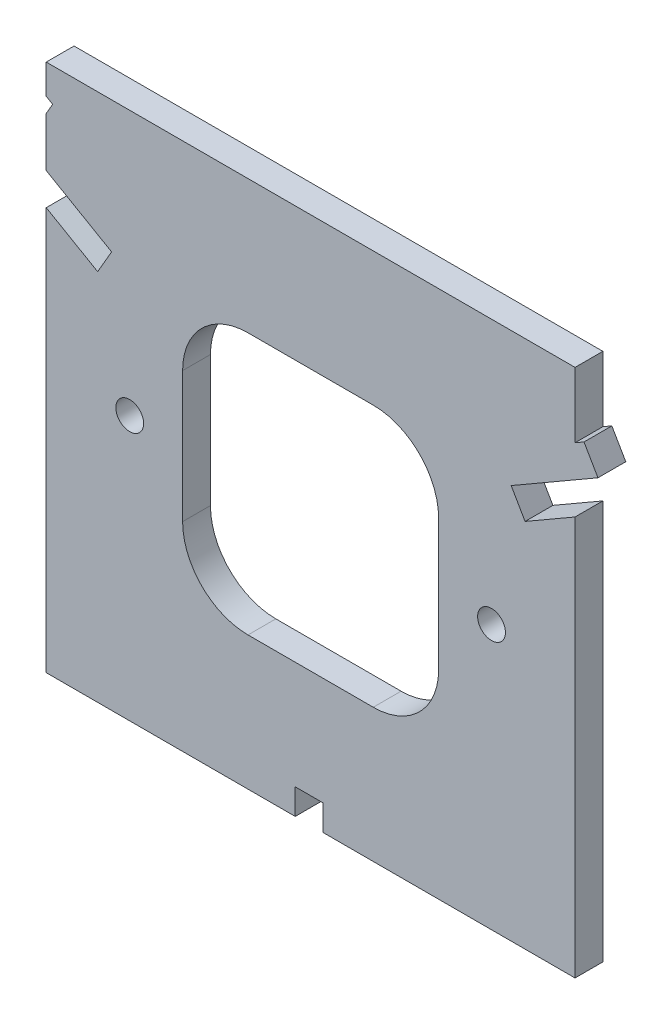
ISO-10303-21;
HEADER;
FILE_DESCRIPTION(('STEP AP214'),'2;1');
FILE_NAME('part.step','',(''),(''),'','','');
FILE_SCHEMA(('AUTOMOTIVE_DESIGN { 1 0 10303 214 1 1 1 1 }'));
ENDSEC;
DATA;
#1=APPLICATION_CONTEXT('core data for automotive mechanical design processes');
#2=APPLICATION_PROTOCOL_DEFINITION('international standard','automotive_design',2000,#1);
#3=PRODUCT_CONTEXT('',#1,'mechanical');
#4=PRODUCT('Part','Part','',(#3));
#5=PRODUCT_RELATED_PRODUCT_CATEGORY('part','',(#4));
#6=PRODUCT_DEFINITION_FORMATION('','',#4);
#7=PRODUCT_DEFINITION_CONTEXT('part definition',#1,'design');
#8=PRODUCT_DEFINITION('design','',#6,#7);
#9=PRODUCT_DEFINITION_SHAPE('','',#8);
#10=(LENGTH_UNIT() NAMED_UNIT(*) SI_UNIT(.MILLI.,.METRE.));
#11=(NAMED_UNIT(*) PLANE_ANGLE_UNIT() SI_UNIT($,.RADIAN.));
#12=(NAMED_UNIT(*) SI_UNIT($,.STERADIAN.) SOLID_ANGLE_UNIT());
#13=UNCERTAINTY_MEASURE_WITH_UNIT(LENGTH_MEASURE(1.E-05),#10,'distance_accuracy_value','');
#14=(GEOMETRIC_REPRESENTATION_CONTEXT(3) GLOBAL_UNCERTAINTY_ASSIGNED_CONTEXT((#13)) GLOBAL_UNIT_ASSIGNED_CONTEXT((#10,
#11,#12)) REPRESENTATION_CONTEXT('',''));
#15=CARTESIAN_POINT('',(0.,0.,0.));
#16=DIRECTION('',(0.,0.,1.));
#17=DIRECTION('',(1.,0.,0.));
#18=AXIS2_PLACEMENT_3D('',#15,#16,#17);
#19=CARTESIAN_POINT('',(0.,0.,5.));
#20=DIRECTION('',(0.,0.,-1.));
#21=DIRECTION('',(-1.,0.,0.));
#22=AXIS2_PLACEMENT_3D('',#19,#20,#21);
#23=PLANE('',#22);
#24=CARTESIAN_POINT('',(8.4009612500342,-1.93892346319448,5.));
#25=DIRECTION('',(0.,0.,1.));
#26=DIRECTION('',(1.,0.,0.));
#27=AXIS2_PLACEMENT_3D('',#24,#25,#26);
#28=CIRCLE('',#27,2.50000000000002);
#29=CARTESIAN_POINT('',(10.9009612500342,-1.93892346319448,5.));
#30=VERTEX_POINT('',#29);
#31=EDGE_CURVE('E262',#30,#30,#28,.T.);
#32=ORIENTED_EDGE('',*,*,#31,.F.);
#33=EDGE_LOOP('',(#32));
#34=FACE_BOUND('',#33,.T.);
#35=DIRECTION('',(0.,1.,0.));
#36=VECTOR('',#35,1.);
#37=CARTESIAN_POINT('',(23.4009612500341,33.8352715378525,5.));
#38=LINE('',#37,#36);
#39=CARTESIAN_POINT('',(23.4009612500341,33.8352715378525,5.));
#40=VERTEX_POINT('',#39);
#41=CARTESIAN_POINT('',(23.4009612500341,45.5610765368055,5.));
#42=VERTEX_POINT('',#41);
#43=EDGE_CURVE('E293',#40,#42,#38,.T.);
#44=ORIENTED_EDGE('',*,*,#43,.T.);
#45=DIRECTION('',(-1.,0.,0.));
#46=VECTOR('',#45,1.);
#47=CARTESIAN_POINT('',(-71.5990387499659,45.5610765368055,5.));
#48=LINE('',#47,#46);
#49=CARTESIAN_POINT('',(-71.5990387499659,45.5610765368055,5.));
#50=VERTEX_POINT('',#49);
#51=EDGE_CURVE('E296',#42,#50,#48,.T.);
#52=ORIENTED_EDGE('',*,*,#51,.T.);
#53=DIRECTION('',(0.,-1.,0.));
#54=VECTOR('',#53,1.);
#55=CARTESIAN_POINT('',(-71.5990387499659,40.2291678763583,5.));
#56=LINE('',#55,#54);
#57=CARTESIAN_POINT('',(-71.5990387499659,40.2291678763583,5.));
#58=VERTEX_POINT('',#57);
#59=EDGE_CURVE('E299',#50,#58,#56,.T.);
#60=ORIENTED_EDGE('',*,*,#59,.T.);
#61=DIRECTION('',(0.866025403784445,-0.499999999999989,0.));
#62=VECTOR('',#61,1.);
#63=CARTESIAN_POINT('',(-70.4449389685419,39.5628480568815,5.));
#64=LINE('',#63,#62);
#65=CARTESIAN_POINT('',(-70.4449389685419,39.5628480568815,5.));
#66=VERTEX_POINT('',#65);
#67=EDGE_CURVE('E301',#58,#66,#64,.T.);
#68=ORIENTED_EDGE('',*,*,#67,.T.);
#69=DIRECTION('',(-0.500000000000001,-0.866025403784438,0.));
#70=VECTOR('',#69,1.);
#71=CARTESIAN_POINT('',(-71.5990387499659,37.5638885984511,5.));
#72=LINE('',#71,#70);
#73=CARTESIAN_POINT('',(-71.5990387499659,37.5638885984511,5.));
#74=VERTEX_POINT('',#73);
#75=EDGE_CURVE('E303',#66,#74,#72,.T.);
#76=ORIENTED_EDGE('',*,*,#75,.T.);
#77=DIRECTION('',(0.,-1.,0.));
#78=VECTOR('',#77,1.);
#79=CARTESIAN_POINT('',(-71.5990387499659,28.682162492566,5.));
#80=LINE('',#79,#78);
#81=CARTESIAN_POINT('',(-71.5990387499659,28.682162492566,5.));
#82=VERTEX_POINT('',#81);
#83=EDGE_CURVE('E305',#74,#82,#80,.T.);
#84=ORIENTED_EDGE('',*,*,#83,.T.);
#85=DIRECTION('',(0.866025403784435,-0.500000000000006,0.));
#86=VECTOR('',#85,1.);
#87=CARTESIAN_POINT('',(-71.5990387499659,28.682162492566,5.));
#88=LINE('',#87,#86);
#89=CARTESIAN_POINT('',(-59.8564817004216,21.902594019037,5.));
#90=VERTEX_POINT('',#89);
#91=EDGE_CURVE('E307',#82,#90,#88,.T.);
#92=ORIENTED_EDGE('',*,*,#91,.T.);
#93=DIRECTION('',(-0.500000000000005,-0.866025403784436,0.));
#94=VECTOR('',#93,1.);
#95=CARTESIAN_POINT('',(-59.8564817004216,21.902594019037,5.));
#96=LINE('',#95,#94);
#97=CARTESIAN_POINT('',(-62.3564817004217,17.5724670001147,5.));
#98=VERTEX_POINT('',#97);
#99=EDGE_CURVE('E309',#90,#98,#96,.T.);
#100=ORIENTED_EDGE('',*,*,#99,.T.);
#101=DIRECTION('',(-0.866025403784435,0.500000000000006,0.));
#102=VECTOR('',#101,1.);
#103=CARTESIAN_POINT('',(-62.3564817004217,17.5724670001147,5.));
#104=LINE('',#103,#102);
#105=CARTESIAN_POINT('',(-71.5990387499659,22.9086598006696,5.));
#106=VERTEX_POINT('',#105);
#107=EDGE_CURVE('E311',#98,#106,#104,.T.);
#108=ORIENTED_EDGE('',*,*,#107,.T.);
#109=DIRECTION('',(0.,-1.,0.));
#110=VECTOR('',#109,1.);
#111=CARTESIAN_POINT('',(-71.5990387499659,-49.4389234631945,5.));
#112=LINE('',#111,#110);
#113=CARTESIAN_POINT('',(-71.5990387499659,-49.4389234631945,5.));
#114=VERTEX_POINT('',#113);
#115=EDGE_CURVE('E313',#106,#114,#112,.T.);
#116=ORIENTED_EDGE('',*,*,#115,.T.);
#117=DIRECTION('',(1.,0.,0.));
#118=VECTOR('',#117,1.);
#119=CARTESIAN_POINT('',(-71.5990387499659,-49.4389234631945,5.));
#120=LINE('',#119,#118);
#121=CARTESIAN_POINT('',(-26.8676770791211,-49.4389234631945,5.));
#122=VERTEX_POINT('',#121);
#123=EDGE_CURVE('E315',#114,#122,#120,.T.);
#124=ORIENTED_EDGE('',*,*,#123,.T.);
#125=DIRECTION('',(0.,1.,0.));
#126=VECTOR('',#125,1.);
#127=CARTESIAN_POINT('',(-26.8676770791212,-44.8265361737777,5.));
#128=LINE('',#127,#126);
#129=CARTESIAN_POINT('',(-26.8676770791212,-44.8265361737777,5.));
#130=VERTEX_POINT('',#129);
#131=EDGE_CURVE('E317',#122,#130,#128,.T.);
#132=ORIENTED_EDGE('',*,*,#131,.T.);
#133=DIRECTION('',(1.,0.,0.));
#134=VECTOR('',#133,1.);
#135=CARTESIAN_POINT('',(-21.8676770791211,-44.8265361737777,5.));
#136=LINE('',#135,#134);
#137=CARTESIAN_POINT('',(-21.8676770791211,-44.8265361737777,5.));
#138=VERTEX_POINT('',#137);
#139=EDGE_CURVE('E319',#130,#138,#136,.T.);
#140=ORIENTED_EDGE('',*,*,#139,.T.);
#141=DIRECTION('',(0.,-1.,0.));
#142=VECTOR('',#141,1.);
#143=CARTESIAN_POINT('',(-21.8676770791211,-49.4389234631945,5.));
#144=LINE('',#143,#142);
#145=CARTESIAN_POINT('',(-21.8676770791211,-49.4389234631945,5.));
#146=VERTEX_POINT('',#145);
#147=EDGE_CURVE('E321',#138,#146,#144,.T.);
#148=ORIENTED_EDGE('',*,*,#147,.T.);
#149=DIRECTION('',(1.,0.,0.));
#150=VECTOR('',#149,1.);
#151=CARTESIAN_POINT('',(-21.8676770791211,-49.4389234631945,5.));
#152=LINE('',#151,#150);
#153=CARTESIAN_POINT('',(23.4009612500341,-49.4389234631945,5.));
#154=VERTEX_POINT('',#153);
#155=EDGE_CURVE('E323',#146,#154,#152,.T.);
#156=ORIENTED_EDGE('',*,*,#155,.T.);
#157=DIRECTION('',(0.,1.,0.));
#158=VECTOR('',#157,1.);
#159=CARTESIAN_POINT('',(23.4009612500341,-49.4389234631945,5.));
#160=LINE('',#159,#158);
#161=CARTESIAN_POINT('',(23.4009612500341,22.2882661540598,5.));
#162=VERTEX_POINT('',#161);
#163=EDGE_CURVE('E325',#154,#162,#160,.T.);
#164=ORIENTED_EDGE('',*,*,#163,.T.);
#165=DIRECTION('',(-0.866025403784432,-0.500000000000011,0.));
#166=VECTOR('',#165,1.);
#167=CARTESIAN_POINT('',(23.4009612500341,22.2882661540598,5.));
#168=LINE('',#167,#166);
#169=CARTESIAN_POINT('',(14.4270425296453,17.1071717651573,5.));
#170=VERTEX_POINT('',#169);
#171=EDGE_CURVE('E327',#162,#170,#168,.T.);
#172=ORIENTED_EDGE('',*,*,#171,.T.);
#173=DIRECTION('',(-0.500000000000011,0.866025403784432,0.));
#174=VECTOR('',#173,1.);
#175=CARTESIAN_POINT('',(14.4270425296453,17.1071717651573,5.));
#176=LINE('',#175,#174);
#177=CARTESIAN_POINT('',(11.9270425296452,21.4372987840795,5.));
#178=VERTEX_POINT('',#177);
#179=EDGE_CURVE('E329',#170,#178,#176,.T.);
#180=ORIENTED_EDGE('',*,*,#179,.T.);
#181=DIRECTION('',(0.866025403784441,0.499999999999996,0.));
#182=VECTOR('',#181,1.);
#183=CARTESIAN_POINT('',(11.9270425296452,21.4372987840795,5.));
#184=LINE('',#183,#182);
#185=CARTESIAN_POINT('',(27.5154997977651,30.4372987840794,5.));
#186=VERTEX_POINT('',#185);
#187=EDGE_CURVE('E331',#178,#186,#184,.T.);
#188=ORIENTED_EDGE('',*,*,#187,.T.);
#189=DIRECTION('',(-0.499999999999993,0.866025403784443,0.));
#190=VECTOR('',#189,1.);
#191=CARTESIAN_POINT('',(27.5154997977651,30.4372987840794,5.));
#192=LINE('',#191,#190);
#193=CARTESIAN_POINT('',(25.0154997977649,34.7674258030019,5.));
#194=VERTEX_POINT('',#193);
#195=EDGE_CURVE('E333',#186,#194,#192,.T.);
#196=ORIENTED_EDGE('',*,*,#195,.T.);
#197=DIRECTION('',(-0.866025403784439,-0.5,0.));
#198=VECTOR('',#197,1.);
#199=CARTESIAN_POINT('',(25.0154997977649,34.7674258030019,5.));
#200=LINE('',#199,#198);
#201=EDGE_CURVE('E335',#194,#40,#200,.T.);
#202=ORIENTED_EDGE('',*,*,#201,.T.);
#203=EDGE_LOOP('',(#44,#52,#60,#68,#76,#84,#92,#100,#108,#116,#124,#132,#140,#148,#156,#164,
#172,#180,#188,#196,#202));
#204=FACE_BOUND('',#203,.T.);
#205=CARTESIAN_POINT('',(-12.8490387499658,9.81107653680552,5.));
#206=DIRECTION('',(0.,0.,1.));
#207=DIRECTION('',(1.,0.,0.));
#208=AXIS2_PLACEMENT_3D('',#205,#206,#207);
#209=CIRCLE('',#208,11.75);
#210=CARTESIAN_POINT('',(-1.09903874996581,9.81107653680552,5.));
#211=VERTEX_POINT('',#210);
#212=CARTESIAN_POINT('',(-12.8490387499658,21.5610765368055,5.));
#213=VERTEX_POINT('',#212);
#214=EDGE_CURVE('E224',#211,#213,#209,.T.);
#215=ORIENTED_EDGE('',*,*,#214,.F.);
#216=DIRECTION('',(0.,1.,0.));
#217=VECTOR('',#216,1.);
#218=CARTESIAN_POINT('',(-1.09903874996581,-13.6889234631945,5.));
#219=LINE('',#218,#217);
#220=CARTESIAN_POINT('',(-1.09903874996628,-13.6889234631945,5.));
#221=VERTEX_POINT('',#220);
#222=EDGE_CURVE('E259',#221,#211,#219,.T.);
#223=ORIENTED_EDGE('',*,*,#222,.F.);
#224=CARTESIAN_POINT('',(-12.8490387499658,-13.6889234631945,5.));
#225=DIRECTION('',(0.,0.,1.));
#226=DIRECTION('',(1.,0.,0.));
#227=AXIS2_PLACEMENT_3D('',#224,#225,#226);
#228=CIRCLE('',#227,11.75);
#229=CARTESIAN_POINT('',(-12.8490387499658,-25.4389234631945,5.));
#230=VERTEX_POINT('',#229);
#231=EDGE_CURVE('E257',#230,#221,#228,.T.);
#232=ORIENTED_EDGE('',*,*,#231,.F.);
#233=DIRECTION('',(1.,0.,0.));
#234=VECTOR('',#233,1.);
#235=CARTESIAN_POINT('',(-12.8490387499658,-25.4389234631945,5.));
#236=LINE('',#235,#234);
#237=CARTESIAN_POINT('',(-35.3490387499658,-25.4389234631945,5.));
#238=VERTEX_POINT('',#237);
#239=EDGE_CURVE('E255',#238,#230,#236,.T.);
#240=ORIENTED_EDGE('',*,*,#239,.F.);
#241=CARTESIAN_POINT('',(-35.3490387499658,-13.6889234631945,5.));
#242=DIRECTION('',(0.,0.,1.));
#243=DIRECTION('',(1.,0.,0.));
#244=AXIS2_PLACEMENT_3D('',#241,#242,#243);
#245=CIRCLE('',#244,11.75);
#246=CARTESIAN_POINT('',(-47.0990387499658,-13.6889234631945,5.));
#247=VERTEX_POINT('',#246);
#248=EDGE_CURVE('E253',#247,#238,#245,.T.);
#249=ORIENTED_EDGE('',*,*,#248,.F.);
#250=DIRECTION('',(0.,-1.,0.));
#251=VECTOR('',#250,1.);
#252=CARTESIAN_POINT('',(-47.0990387499658,9.81107653680551,5.));
#253=LINE('',#252,#251);
#254=CARTESIAN_POINT('',(-47.0990387499658,9.81107653680551,5.));
#255=VERTEX_POINT('',#254);
#256=EDGE_CURVE('E248',#255,#247,#253,.T.);
#257=ORIENTED_EDGE('',*,*,#256,.F.);
#258=CARTESIAN_POINT('',(-35.3490387499658,9.81107653680551,5.));
#259=DIRECTION('',(0.,0.,1.));
#260=DIRECTION('',(1.,0.,0.));
#261=AXIS2_PLACEMENT_3D('',#258,#259,#260);
#262=CIRCLE('',#261,11.75);
#263=CARTESIAN_POINT('',(-35.3490387499658,21.5610765368055,5.));
#264=VERTEX_POINT('',#263);
#265=EDGE_CURVE('E246',#264,#255,#262,.T.);
#266=ORIENTED_EDGE('',*,*,#265,.F.);
#267=DIRECTION('',(-1.,0.,0.));
#268=VECTOR('',#267,1.);
#269=CARTESIAN_POINT('',(-12.8490387499658,21.5610765368055,5.));
#270=LINE('',#269,#268);
#271=EDGE_CURVE('E232',#213,#264,#270,.T.);
#272=ORIENTED_EDGE('',*,*,#271,.F.);
#273=EDGE_LOOP('',(#215,#223,#232,#240,#249,#257,#266,#272));
#274=FACE_BOUND('',#273,.T.);
#275=CARTESIAN_POINT('',(-56.5990387499658,-1.93892346319448,5.));
#276=DIRECTION('',(0.,0.,1.));
#277=DIRECTION('',(1.,0.,0.));
#278=AXIS2_PLACEMENT_3D('',#275,#276,#277);
#279=CIRCLE('',#278,2.50000000000002);
#280=CARTESIAN_POINT('',(-54.0990387499658,-1.93892346319448,5.));
#281=VERTEX_POINT('',#280);
#282=EDGE_CURVE('E836',#281,#281,#279,.T.);
#283=ORIENTED_EDGE('',*,*,#282,.F.);
#284=EDGE_LOOP('',(#283));
#285=FACE_BOUND('',#284,.T.);
#286=ADVANCED_FACE('F33',(#34,#204,#274,#285),#23,.F.);
#287=CARTESIAN_POINT('',(0.,0.,0.));
#288=DIRECTION('',(0.,0.,-1.));
#289=DIRECTION('',(-1.,0.,0.));
#290=AXIS2_PLACEMENT_3D('',#287,#288,#289);
#291=PLANE('',#290);
#292=CARTESIAN_POINT('',(8.4009612500342,-1.93892346319448,0.));
#293=DIRECTION('',(0.,0.,1.));
#294=DIRECTION('',(1.,0.,0.));
#295=AXIS2_PLACEMENT_3D('',#292,#293,#294);
#296=CIRCLE('',#295,2.50000000000002);
#297=CARTESIAN_POINT('',(10.9009612500342,-1.93892346319448,0.));
#298=VERTEX_POINT('',#297);
#299=EDGE_CURVE('E842',#298,#298,#296,.T.);
#300=ORIENTED_EDGE('',*,*,#299,.T.);
#301=EDGE_LOOP('',(#300));
#302=FACE_BOUND('',#301,.T.);
#303=DIRECTION('',(0.,1.,0.));
#304=VECTOR('',#303,1.);
#305=CARTESIAN_POINT('',(23.4009612500341,33.8352715378525,0.));
#306=LINE('',#305,#304);
#307=CARTESIAN_POINT('',(23.4009612500341,33.8352715378525,0.));
#308=VERTEX_POINT('',#307);
#309=CARTESIAN_POINT('',(23.4009612500341,45.5610765368055,0.));
#310=VERTEX_POINT('',#309);
#311=EDGE_CURVE('E240',#308,#310,#306,.T.);
#312=ORIENTED_EDGE('',*,*,#311,.F.);
#313=DIRECTION('',(-0.866025403784439,-0.5,0.));
#314=VECTOR('',#313,1.);
#315=CARTESIAN_POINT('',(25.0154997977649,34.7674258030019,0.));
#316=LINE('',#315,#314);
#317=CARTESIAN_POINT('',(25.0154997977649,34.7674258030019,0.));
#318=VERTEX_POINT('',#317);
#319=EDGE_CURVE('E297',#318,#308,#316,.T.);
#320=ORIENTED_EDGE('',*,*,#319,.F.);
#321=DIRECTION('',(-0.499999999999993,0.866025403784443,0.));
#322=VECTOR('',#321,1.);
#323=CARTESIAN_POINT('',(27.5154997977651,30.4372987840794,0.));
#324=LINE('',#323,#322);
#325=CARTESIAN_POINT('',(27.5154997977651,30.4372987840794,0.));
#326=VERTEX_POINT('',#325);
#327=EDGE_CURVE('E376',#326,#318,#324,.T.);
#328=ORIENTED_EDGE('',*,*,#327,.F.);
#329=DIRECTION('',(0.866025403784441,0.499999999999996,0.));
#330=VECTOR('',#329,1.);
#331=CARTESIAN_POINT('',(11.9270425296452,21.4372987840795,0.));
#332=LINE('',#331,#330);
#333=CARTESIAN_POINT('',(11.9270425296452,21.4372987840795,0.));
#334=VERTEX_POINT('',#333);
#335=EDGE_CURVE('E374',#334,#326,#332,.T.);
#336=ORIENTED_EDGE('',*,*,#335,.F.);
#337=DIRECTION('',(-0.500000000000011,0.866025403784432,0.));
#338=VECTOR('',#337,1.);
#339=CARTESIAN_POINT('',(14.4270425296453,17.1071717651573,0.));
#340=LINE('',#339,#338);
#341=CARTESIAN_POINT('',(14.4270425296453,17.1071717651573,0.));
#342=VERTEX_POINT('',#341);
#343=EDGE_CURVE('E372',#342,#334,#340,.T.);
#344=ORIENTED_EDGE('',*,*,#343,.F.);
#345=DIRECTION('',(-0.866025403784432,-0.500000000000011,0.));
#346=VECTOR('',#345,1.);
#347=CARTESIAN_POINT('',(23.4009612500341,22.2882661540598,0.));
#348=LINE('',#347,#346);
#349=CARTESIAN_POINT('',(23.4009612500341,22.2882661540598,0.));
#350=VERTEX_POINT('',#349);
#351=EDGE_CURVE('E370',#350,#342,#348,.T.);
#352=ORIENTED_EDGE('',*,*,#351,.F.);
#353=DIRECTION('',(0.,1.,0.));
#354=VECTOR('',#353,1.);
#355=CARTESIAN_POINT('',(23.4009612500341,-49.4389234631945,0.));
#356=LINE('',#355,#354);
#357=CARTESIAN_POINT('',(23.4009612500341,-49.4389234631945,0.));
#358=VERTEX_POINT('',#357);
#359=EDGE_CURVE('E368',#358,#350,#356,.T.);
#360=ORIENTED_EDGE('',*,*,#359,.F.);
#361=DIRECTION('',(1.,0.,0.));
#362=VECTOR('',#361,1.);
#363=CARTESIAN_POINT('',(-21.8676770791211,-49.4389234631945,0.));
#364=LINE('',#363,#362);
#365=CARTESIAN_POINT('',(-21.8676770791211,-49.4389234631945,0.));
#366=VERTEX_POINT('',#365);
#367=EDGE_CURVE('E366',#366,#358,#364,.T.);
#368=ORIENTED_EDGE('',*,*,#367,.F.);
#369=DIRECTION('',(0.,-1.,0.));
#370=VECTOR('',#369,1.);
#371=CARTESIAN_POINT('',(-21.8676770791211,-49.4389234631945,0.));
#372=LINE('',#371,#370);
#373=CARTESIAN_POINT('',(-21.8676770791211,-44.8265361737777,0.));
#374=VERTEX_POINT('',#373);
#375=EDGE_CURVE('E364',#374,#366,#372,.T.);
#376=ORIENTED_EDGE('',*,*,#375,.F.);
#377=DIRECTION('',(1.,0.,0.));
#378=VECTOR('',#377,1.);
#379=CARTESIAN_POINT('',(-21.8676770791211,-44.8265361737777,0.));
#380=LINE('',#379,#378);
#381=CARTESIAN_POINT('',(-26.8676770791212,-44.8265361737777,0.));
#382=VERTEX_POINT('',#381);
#383=EDGE_CURVE('E362',#382,#374,#380,.T.);
#384=ORIENTED_EDGE('',*,*,#383,.F.);
#385=DIRECTION('',(0.,1.,0.));
#386=VECTOR('',#385,1.);
#387=CARTESIAN_POINT('',(-26.8676770791212,-44.8265361737777,0.));
#388=LINE('',#387,#386);
#389=CARTESIAN_POINT('',(-26.8676770791211,-49.4389234631945,0.));
#390=VERTEX_POINT('',#389);
#391=EDGE_CURVE('E360',#390,#382,#388,.T.);
#392=ORIENTED_EDGE('',*,*,#391,.F.);
#393=DIRECTION('',(1.,0.,0.));
#394=VECTOR('',#393,1.);
#395=CARTESIAN_POINT('',(-71.5990387499659,-49.4389234631945,0.));
#396=LINE('',#395,#394);
#397=CARTESIAN_POINT('',(-71.5990387499659,-49.4389234631945,0.));
#398=VERTEX_POINT('',#397);
#399=EDGE_CURVE('E358',#398,#390,#396,.T.);
#400=ORIENTED_EDGE('',*,*,#399,.F.);
#401=DIRECTION('',(0.,-1.,0.));
#402=VECTOR('',#401,1.);
#403=CARTESIAN_POINT('',(-71.5990387499659,-49.4389234631945,0.));
#404=LINE('',#403,#402);
#405=CARTESIAN_POINT('',(-71.5990387499659,22.9086598006696,0.));
#406=VERTEX_POINT('',#405);
#407=EDGE_CURVE('E356',#406,#398,#404,.T.);
#408=ORIENTED_EDGE('',*,*,#407,.F.);
#409=DIRECTION('',(-0.866025403784435,0.500000000000006,0.));
#410=VECTOR('',#409,1.);
#411=CARTESIAN_POINT('',(-62.3564817004217,17.5724670001147,0.));
#412=LINE('',#411,#410);
#413=CARTESIAN_POINT('',(-62.3564817004217,17.5724670001147,0.));
#414=VERTEX_POINT('',#413);
#415=EDGE_CURVE('E354',#414,#406,#412,.T.);
#416=ORIENTED_EDGE('',*,*,#415,.F.);
#417=DIRECTION('',(-0.500000000000005,-0.866025403784436,0.));
#418=VECTOR('',#417,1.);
#419=CARTESIAN_POINT('',(-59.8564817004216,21.902594019037,0.));
#420=LINE('',#419,#418);
#421=CARTESIAN_POINT('',(-59.8564817004216,21.902594019037,0.));
#422=VERTEX_POINT('',#421);
#423=EDGE_CURVE('E352',#422,#414,#420,.T.);
#424=ORIENTED_EDGE('',*,*,#423,.F.);
#425=DIRECTION('',(0.866025403784435,-0.500000000000006,0.));
#426=VECTOR('',#425,1.);
#427=CARTESIAN_POINT('',(-71.5990387499659,28.682162492566,0.));
#428=LINE('',#427,#426);
#429=CARTESIAN_POINT('',(-71.5990387499659,28.682162492566,0.));
#430=VERTEX_POINT('',#429);
#431=EDGE_CURVE('E350',#430,#422,#428,.T.);
#432=ORIENTED_EDGE('',*,*,#431,.F.);
#433=DIRECTION('',(0.,-1.,0.));
#434=VECTOR('',#433,1.);
#435=CARTESIAN_POINT('',(-71.5990387499659,28.682162492566,0.));
#436=LINE('',#435,#434);
#437=CARTESIAN_POINT('',(-71.5990387499659,37.5638885984511,0.));
#438=VERTEX_POINT('',#437);
#439=EDGE_CURVE('E348',#438,#430,#436,.T.);
#440=ORIENTED_EDGE('',*,*,#439,.F.);
#441=DIRECTION('',(-0.500000000000001,-0.866025403784438,0.));
#442=VECTOR('',#441,1.);
#443=CARTESIAN_POINT('',(-71.5990387499659,37.5638885984511,0.));
#444=LINE('',#443,#442);
#445=CARTESIAN_POINT('',(-70.4449389685419,39.5628480568815,0.));
#446=VERTEX_POINT('',#445);
#447=EDGE_CURVE('E346',#446,#438,#444,.T.);
#448=ORIENTED_EDGE('',*,*,#447,.F.);
#449=DIRECTION('',(0.866025403784445,-0.499999999999989,0.));
#450=VECTOR('',#449,1.);
#451=CARTESIAN_POINT('',(-70.4449389685419,39.5628480568815,0.));
#452=LINE('',#451,#450);
#453=CARTESIAN_POINT('',(-71.5990387499659,40.2291678763583,0.));
#454=VERTEX_POINT('',#453);
#455=EDGE_CURVE('E344',#454,#446,#452,.T.);
#456=ORIENTED_EDGE('',*,*,#455,.F.);
#457=DIRECTION('',(0.,-1.,0.));
#458=VECTOR('',#457,1.);
#459=CARTESIAN_POINT('',(-71.5990387499659,40.2291678763583,0.));
#460=LINE('',#459,#458);
#461=CARTESIAN_POINT('',(-71.5990387499659,45.5610765368055,0.));
#462=VERTEX_POINT('',#461);
#463=EDGE_CURVE('E342',#462,#454,#460,.T.);
#464=ORIENTED_EDGE('',*,*,#463,.F.);
#465=DIRECTION('',(-1.,0.,0.));
#466=VECTOR('',#465,1.);
#467=CARTESIAN_POINT('',(-71.5990387499659,45.5610765368055,0.));
#468=LINE('',#467,#466);
#469=EDGE_CURVE('E340',#310,#462,#468,.T.);
#470=ORIENTED_EDGE('',*,*,#469,.F.);
#471=EDGE_LOOP('',(#312,#320,#328,#336,#344,#352,#360,#368,#376,#384,#392,#400,#408,#416,#424,
#432,#440,#448,#456,#464,#470));
#472=FACE_BOUND('',#471,.T.);
#473=DIRECTION('',(0.,1.,0.));
#474=VECTOR('',#473,1.);
#475=CARTESIAN_POINT('',(-1.09903874996581,9.81107653680552,0.));
#476=LINE('',#475,#474);
#477=CARTESIAN_POINT('',(-1.09903874996581,-13.6889234631945,0.));
#478=VERTEX_POINT('',#477);
#479=CARTESIAN_POINT('',(-1.09903874996581,9.81107653680552,0.));
#480=VERTEX_POINT('',#479);
#481=EDGE_CURVE('E233',#478,#480,#476,.T.);
#482=ORIENTED_EDGE('',*,*,#481,.T.);
#483=CARTESIAN_POINT('',(-12.8490387499658,9.81107653680552,0.));
#484=DIRECTION('',(0.,0.,1.));
#485=DIRECTION('',(1.,0.,0.));
#486=AXIS2_PLACEMENT_3D('',#483,#484,#485);
#487=CIRCLE('',#486,11.75);
#488=CARTESIAN_POINT('',(-12.8490387499658,21.5610765368055,0.));
#489=VERTEX_POINT('',#488);
#490=EDGE_CURVE('E56',#480,#489,#487,.T.);
#491=ORIENTED_EDGE('',*,*,#490,.T.);
#492=DIRECTION('',(-1.,0.,0.));
#493=VECTOR('',#492,1.);
#494=CARTESIAN_POINT('',(-12.8490387499658,21.5610765368055,0.));
#495=LINE('',#494,#493);
#496=CARTESIAN_POINT('',(-35.3490387499658,21.5610765368055,0.));
#497=VERTEX_POINT('',#496);
#498=EDGE_CURVE('E239',#489,#497,#495,.T.);
#499=ORIENTED_EDGE('',*,*,#498,.T.);
#500=CARTESIAN_POINT('',(-35.3490387499658,9.81107653680551,0.));
#501=DIRECTION('',(0.,0.,1.));
#502=DIRECTION('',(1.,0.,0.));
#503=AXIS2_PLACEMENT_3D('',#500,#501,#502);
#504=CIRCLE('',#503,11.75);
#505=CARTESIAN_POINT('',(-47.0990387499658,9.81107653680551,0.));
#506=VERTEX_POINT('',#505);
#507=EDGE_CURVE('E264',#497,#506,#504,.T.);
#508=ORIENTED_EDGE('',*,*,#507,.T.);
#509=DIRECTION('',(0.,-1.,0.));
#510=VECTOR('',#509,1.);
#511=CARTESIAN_POINT('',(-47.0990387499658,-13.6889234631945,0.));
#512=LINE('',#511,#510);
#513=CARTESIAN_POINT('',(-47.0990387499658,-13.6889234631945,0.));
#514=VERTEX_POINT('',#513);
#515=EDGE_CURVE('E267',#506,#514,#512,.T.);
#516=ORIENTED_EDGE('',*,*,#515,.T.);
#517=CARTESIAN_POINT('',(-35.3490387499658,-13.6889234631945,0.));
#518=DIRECTION('',(0.,0.,1.));
#519=DIRECTION('',(1.,0.,0.));
#520=AXIS2_PLACEMENT_3D('',#517,#518,#519);
#521=CIRCLE('',#520,11.75);
#522=CARTESIAN_POINT('',(-35.3490387499658,-25.4389234631945,0.));
#523=VERTEX_POINT('',#522);
#524=EDGE_CURVE('E270',#514,#523,#521,.T.);
#525=ORIENTED_EDGE('',*,*,#524,.T.);
#526=DIRECTION('',(1.,0.,0.));
#527=VECTOR('',#526,1.);
#528=CARTESIAN_POINT('',(-12.8490387499658,-25.4389234631945,0.));
#529=LINE('',#528,#527);
#530=CARTESIAN_POINT('',(-12.8490387499658,-25.4389234631945,0.));
#531=VERTEX_POINT('',#530);
#532=EDGE_CURVE('E273',#523,#531,#529,.T.);
#533=ORIENTED_EDGE('',*,*,#532,.T.);
#534=CARTESIAN_POINT('',(-12.8490387499658,-13.6889234631945,0.));
#535=DIRECTION('',(0.,0.,1.));
#536=DIRECTION('',(1.,0.,0.));
#537=AXIS2_PLACEMENT_3D('',#534,#535,#536);
#538=CIRCLE('',#537,11.75);
#539=EDGE_CURVE('E276',#531,#478,#538,.T.);
#540=ORIENTED_EDGE('',*,*,#539,.T.);
#541=EDGE_LOOP('',(#482,#491,#499,#508,#516,#525,#533,#540));
#542=FACE_BOUND('',#541,.T.);
#543=CARTESIAN_POINT('',(-56.5990387499658,-1.93892346319448,0.));
#544=DIRECTION('',(0.,0.,1.));
#545=DIRECTION('',(1.,0.,0.));
#546=AXIS2_PLACEMENT_3D('',#543,#544,#545);
#547=CIRCLE('',#546,2.50000000000002);
#548=CARTESIAN_POINT('',(-54.0990387499658,-1.93892346319448,0.));
#549=VERTEX_POINT('',#548);
#550=EDGE_CURVE('E839',#549,#549,#547,.T.);
#551=ORIENTED_EDGE('',*,*,#550,.T.);
#552=EDGE_LOOP('',(#551));
#553=FACE_BOUND('',#552,.T.);
#554=ADVANCED_FACE('F445',(#302,#472,#542,#553),#291,.T.);
#555=CARTESIAN_POINT('',(23.4009612500341,33.8352715378525,5.));
#556=DIRECTION('',(-1.,0.,0.));
#557=DIRECTION('',(0.,0.,1.));
#558=AXIS2_PLACEMENT_3D('',#555,#556,#557);
#559=PLANE('',#558);
#560=ORIENTED_EDGE('',*,*,#311,.T.);
#561=DIRECTION('',(0.,0.,-1.));
#562=VECTOR('',#561,1.);
#563=CARTESIAN_POINT('',(23.4009612500341,45.5610765368055,5.));
#564=LINE('',#563,#562);
#565=EDGE_CURVE('E11',#42,#310,#564,.T.);
#566=ORIENTED_EDGE('',*,*,#565,.F.);
#567=ORIENTED_EDGE('',*,*,#43,.F.);
#568=DIRECTION('',(0.,0.,-1.));
#569=VECTOR('',#568,1.);
#570=CARTESIAN_POINT('',(23.4009612500341,33.8352715378525,5.));
#571=LINE('',#570,#569);
#572=EDGE_CURVE('E337',#40,#308,#571,.T.);
#573=ORIENTED_EDGE('',*,*,#572,.T.);
#574=EDGE_LOOP('',(#560,#566,#567,#573));
#575=FACE_BOUND('',#574,.T.);
#576=ADVANCED_FACE('F35',(#575),#559,.F.);
#577=CARTESIAN_POINT('',(-71.5990387499659,45.5610765368055,5.));
#578=DIRECTION('',(0.,-1.,0.));
#579=DIRECTION('',(0.,0.,-1.));
#580=AXIS2_PLACEMENT_3D('',#577,#578,#579);
#581=PLANE('',#580);
#582=ORIENTED_EDGE('',*,*,#469,.T.);
#583=DIRECTION('',(0.,0.,-1.));
#584=VECTOR('',#583,1.);
#585=CARTESIAN_POINT('',(-71.5990387499659,45.5610765368055,5.));
#586=LINE('',#585,#584);
#587=EDGE_CURVE('E41',#50,#462,#586,.T.);
#588=ORIENTED_EDGE('',*,*,#587,.F.);
#589=ORIENTED_EDGE('',*,*,#51,.F.);
#590=ORIENTED_EDGE('',*,*,#565,.T.);
#591=EDGE_LOOP('',(#582,#588,#589,#590));
#592=FACE_BOUND('',#591,.T.);
#593=ADVANCED_FACE('F462',(#592),#581,.F.);
#594=CARTESIAN_POINT('',(-71.5990387499659,40.2291678763583,5.));
#595=DIRECTION('',(1.,0.,0.));
#596=DIRECTION('',(0.,0.,-1.));
#597=AXIS2_PLACEMENT_3D('',#594,#595,#596);
#598=PLANE('',#597);
#599=ORIENTED_EDGE('',*,*,#463,.T.);
#600=DIRECTION('',(0.,0.,-1.));
#601=VECTOR('',#600,1.);
#602=CARTESIAN_POINT('',(-71.5990387499659,40.2291678763583,5.));
#603=LINE('',#602,#601);
#604=EDGE_CURVE('E432',#58,#454,#603,.T.);
#605=ORIENTED_EDGE('',*,*,#604,.F.);
#606=ORIENTED_EDGE('',*,*,#59,.F.);
#607=ORIENTED_EDGE('',*,*,#587,.T.);
#608=EDGE_LOOP('',(#599,#605,#606,#607));
#609=FACE_BOUND('',#608,.T.);
#610=ADVANCED_FACE('F439',(#609),#598,.F.);
#611=CARTESIAN_POINT('',(-70.4449389685419,39.5628480568815,5.));
#612=DIRECTION('',(0.499999999999989,0.866025403784445,0.));
#613=DIRECTION('',(-0.866025403784445,0.499999999999989,0.));
#614=AXIS2_PLACEMENT_3D('',#611,#612,#613);
#615=PLANE('',#614);
#616=ORIENTED_EDGE('',*,*,#455,.T.);
#617=DIRECTION('',(0.,0.,-1.));
#618=VECTOR('',#617,1.);
#619=CARTESIAN_POINT('',(-70.4449389685419,39.5628480568815,5.));
#620=LINE('',#619,#618);
#621=EDGE_CURVE('E429',#66,#446,#620,.T.);
#622=ORIENTED_EDGE('',*,*,#621,.F.);
#623=ORIENTED_EDGE('',*,*,#67,.F.);
#624=ORIENTED_EDGE('',*,*,#604,.T.);
#625=EDGE_LOOP('',(#616,#622,#623,#624));
#626=FACE_BOUND('',#625,.T.);
#627=ADVANCED_FACE('F451',(#626),#615,.F.);
#628=CARTESIAN_POINT('',(-71.5990387499659,37.5638885984511,5.));
#629=DIRECTION('',(0.866025403784438,-0.500000000000001,0.));
#630=DIRECTION('',(0.500000000000001,0.866025403784438,0.));
#631=AXIS2_PLACEMENT_3D('',#628,#629,#630);
#632=PLANE('',#631);
#633=ORIENTED_EDGE('',*,*,#447,.T.);
#634=DIRECTION('',(0.,0.,-1.));
#635=VECTOR('',#634,1.);
#636=CARTESIAN_POINT('',(-71.5990387499659,37.5638885984511,5.));
#637=LINE('',#636,#635);
#638=EDGE_CURVE('E426',#74,#438,#637,.T.);
#639=ORIENTED_EDGE('',*,*,#638,.F.);
#640=ORIENTED_EDGE('',*,*,#75,.F.);
#641=ORIENTED_EDGE('',*,*,#621,.T.);
#642=EDGE_LOOP('',(#633,#639,#640,#641));
#643=FACE_BOUND('',#642,.T.);
#644=ADVANCED_FACE('F455',(#643),#632,.F.);
#645=CARTESIAN_POINT('',(-71.5990387499659,28.682162492566,5.));
#646=DIRECTION('',(1.,0.,0.));
#647=DIRECTION('',(0.,0.,-1.));
#648=AXIS2_PLACEMENT_3D('',#645,#646,#647);
#649=PLANE('',#648);
#650=ORIENTED_EDGE('',*,*,#439,.T.);
#651=DIRECTION('',(0.,0.,-1.));
#652=VECTOR('',#651,1.);
#653=CARTESIAN_POINT('',(-71.5990387499659,28.682162492566,5.));
#654=LINE('',#653,#652);
#655=EDGE_CURVE('E423',#82,#430,#654,.T.);
#656=ORIENTED_EDGE('',*,*,#655,.F.);
#657=ORIENTED_EDGE('',*,*,#83,.F.);
#658=ORIENTED_EDGE('',*,*,#638,.T.);
#659=EDGE_LOOP('',(#650,#656,#657,#658));
#660=FACE_BOUND('',#659,.T.);
#661=ADVANCED_FACE('F540',(#660),#649,.F.);
#662=CARTESIAN_POINT('',(-71.5990387499659,28.682162492566,5.));
#663=DIRECTION('',(0.500000000000006,0.866025403784435,0.));
#664=DIRECTION('',(-0.866025403784435,0.500000000000006,0.));
#665=AXIS2_PLACEMENT_3D('',#662,#663,#664);
#666=PLANE('',#665);
#667=ORIENTED_EDGE('',*,*,#431,.T.);
#668=DIRECTION('',(0.,0.,-1.));
#669=VECTOR('',#668,1.);
#670=CARTESIAN_POINT('',(-59.8564817004216,21.902594019037,5.));
#671=LINE('',#670,#669);
#672=EDGE_CURVE('E420',#90,#422,#671,.T.);
#673=ORIENTED_EDGE('',*,*,#672,.F.);
#674=ORIENTED_EDGE('',*,*,#91,.F.);
#675=ORIENTED_EDGE('',*,*,#655,.T.);
#676=EDGE_LOOP('',(#667,#673,#674,#675));
#677=FACE_BOUND('',#676,.T.);
#678=ADVANCED_FACE('F538',(#677),#666,.F.);
#679=CARTESIAN_POINT('',(-59.8564817004216,21.902594019037,5.));
#680=DIRECTION('',(0.866025403784436,-0.500000000000005,0.));
#681=DIRECTION('',(0.500000000000005,0.866025403784436,0.));
#682=AXIS2_PLACEMENT_3D('',#679,#680,#681);
#683=PLANE('',#682);
#684=ORIENTED_EDGE('',*,*,#423,.T.);
#685=DIRECTION('',(0.,0.,-1.));
#686=VECTOR('',#685,1.);
#687=CARTESIAN_POINT('',(-62.3564817004217,17.5724670001147,5.));
#688=LINE('',#687,#686);
#689=EDGE_CURVE('E417',#98,#414,#688,.T.);
#690=ORIENTED_EDGE('',*,*,#689,.F.);
#691=ORIENTED_EDGE('',*,*,#99,.F.);
#692=ORIENTED_EDGE('',*,*,#672,.T.);
#693=EDGE_LOOP('',(#684,#690,#691,#692));
#694=FACE_BOUND('',#693,.T.);
#695=ADVANCED_FACE('F534',(#694),#683,.F.);
#696=CARTESIAN_POINT('',(-62.3564817004217,17.5724670001147,5.));
#697=DIRECTION('',(-0.500000000000006,-0.866025403784435,0.));
#698=DIRECTION('',(0.866025403784435,-0.500000000000006,0.));
#699=AXIS2_PLACEMENT_3D('',#696,#697,#698);
#700=PLANE('',#699);
#701=ORIENTED_EDGE('',*,*,#415,.T.);
#702=DIRECTION('',(0.,0.,-1.));
#703=VECTOR('',#702,1.);
#704=CARTESIAN_POINT('',(-71.5990387499659,22.9086598006696,5.));
#705=LINE('',#704,#703);
#706=EDGE_CURVE('E414',#106,#406,#705,.T.);
#707=ORIENTED_EDGE('',*,*,#706,.F.);
#708=ORIENTED_EDGE('',*,*,#107,.F.);
#709=ORIENTED_EDGE('',*,*,#689,.T.);
#710=EDGE_LOOP('',(#701,#707,#708,#709));
#711=FACE_BOUND('',#710,.T.);
#712=ADVANCED_FACE('F529',(#711),#700,.F.);
#713=CARTESIAN_POINT('',(-71.5990387499659,-49.4389234631945,5.));
#714=DIRECTION('',(1.,0.,0.));
#715=DIRECTION('',(0.,1.,0.));
#716=AXIS2_PLACEMENT_3D('',#713,#714,#715);
#717=PLANE('',#716);
#718=ORIENTED_EDGE('',*,*,#407,.T.);
#719=DIRECTION('',(0.,0.,-1.));
#720=VECTOR('',#719,1.);
#721=CARTESIAN_POINT('',(-71.5990387499659,-49.4389234631945,5.));
#722=LINE('',#721,#720);
#723=EDGE_CURVE('E411',#114,#398,#722,.T.);
#724=ORIENTED_EDGE('',*,*,#723,.F.);
#725=ORIENTED_EDGE('',*,*,#115,.F.);
#726=ORIENTED_EDGE('',*,*,#706,.T.);
#727=EDGE_LOOP('',(#718,#724,#725,#726));
#728=FACE_BOUND('',#727,.T.);
#729=ADVANCED_FACE('F523',(#728),#717,.F.);
#730=CARTESIAN_POINT('',(-71.5990387499659,-49.4389234631945,5.));
#731=DIRECTION('',(0.,1.,0.));
#732=DIRECTION('',(0.,0.,1.));
#733=AXIS2_PLACEMENT_3D('',#730,#731,#732);
#734=PLANE('',#733);
#735=ORIENTED_EDGE('',*,*,#399,.T.);
#736=DIRECTION('',(0.,0.,-1.));
#737=VECTOR('',#736,1.);
#738=CARTESIAN_POINT('',(-26.8676770791211,-49.4389234631945,5.));
#739=LINE('',#738,#737);
#740=EDGE_CURVE('E408',#122,#390,#739,.T.);
#741=ORIENTED_EDGE('',*,*,#740,.F.);
#742=ORIENTED_EDGE('',*,*,#123,.F.);
#743=ORIENTED_EDGE('',*,*,#723,.T.);
#744=EDGE_LOOP('',(#735,#741,#742,#743));
#745=FACE_BOUND('',#744,.T.);
#746=ADVANCED_FACE('F519',(#745),#734,.F.);
#747=CARTESIAN_POINT('',(-26.8676770791212,-44.8265361737777,5.));
#748=DIRECTION('',(-1.,0.,0.));
#749=DIRECTION('',(0.,-1.,0.));
#750=AXIS2_PLACEMENT_3D('',#747,#748,#749);
#751=PLANE('',#750);
#752=ORIENTED_EDGE('',*,*,#391,.T.);
#753=DIRECTION('',(0.,0.,-1.));
#754=VECTOR('',#753,1.);
#755=CARTESIAN_POINT('',(-26.8676770791212,-44.8265361737777,5.));
#756=LINE('',#755,#754);
#757=EDGE_CURVE('E405',#130,#382,#756,.T.);
#758=ORIENTED_EDGE('',*,*,#757,.F.);
#759=ORIENTED_EDGE('',*,*,#131,.F.);
#760=ORIENTED_EDGE('',*,*,#740,.T.);
#761=EDGE_LOOP('',(#752,#758,#759,#760));
#762=FACE_BOUND('',#761,.T.);
#763=ADVANCED_FACE('F514',(#762),#751,.F.);
#764=CARTESIAN_POINT('',(-21.8676770791211,-44.8265361737777,5.));
#765=DIRECTION('',(0.,1.,0.));
#766=DIRECTION('',(-1.,0.,0.));
#767=AXIS2_PLACEMENT_3D('',#764,#765,#766);
#768=PLANE('',#767);
#769=ORIENTED_EDGE('',*,*,#383,.T.);
#770=DIRECTION('',(0.,0.,-1.));
#771=VECTOR('',#770,1.);
#772=CARTESIAN_POINT('',(-21.8676770791211,-44.8265361737777,5.));
#773=LINE('',#772,#771);
#774=EDGE_CURVE('E402',#138,#374,#773,.T.);
#775=ORIENTED_EDGE('',*,*,#774,.F.);
#776=ORIENTED_EDGE('',*,*,#139,.F.);
#777=ORIENTED_EDGE('',*,*,#757,.T.);
#778=EDGE_LOOP('',(#769,#775,#776,#777));
#779=FACE_BOUND('',#778,.T.);
#780=ADVANCED_FACE('F508',(#779),#768,.F.);
#781=CARTESIAN_POINT('',(-21.8676770791211,-49.4389234631945,5.));
#782=DIRECTION('',(1.,0.,0.));
#783=DIRECTION('',(0.,1.,0.));
#784=AXIS2_PLACEMENT_3D('',#781,#782,#783);
#785=PLANE('',#784);
#786=ORIENTED_EDGE('',*,*,#375,.T.);
#787=DIRECTION('',(0.,0.,-1.));
#788=VECTOR('',#787,1.);
#789=CARTESIAN_POINT('',(-21.8676770791211,-49.4389234631945,5.));
#790=LINE('',#789,#788);
#791=EDGE_CURVE('E399',#146,#366,#790,.T.);
#792=ORIENTED_EDGE('',*,*,#791,.F.);
#793=ORIENTED_EDGE('',*,*,#147,.F.);
#794=ORIENTED_EDGE('',*,*,#774,.T.);
#795=EDGE_LOOP('',(#786,#792,#793,#794));
#796=FACE_BOUND('',#795,.T.);
#797=ADVANCED_FACE('F504',(#796),#785,.F.);
#798=CARTESIAN_POINT('',(-21.8676770791211,-49.4389234631945,5.));
#799=DIRECTION('',(0.,1.,0.));
#800=DIRECTION('',(0.,0.,1.));
#801=AXIS2_PLACEMENT_3D('',#798,#799,#800);
#802=PLANE('',#801);
#803=ORIENTED_EDGE('',*,*,#367,.T.);
#804=DIRECTION('',(0.,0.,-1.));
#805=VECTOR('',#804,1.);
#806=CARTESIAN_POINT('',(23.4009612500341,-49.4389234631945,5.));
#807=LINE('',#806,#805);
#808=EDGE_CURVE('E396',#154,#358,#807,.T.);
#809=ORIENTED_EDGE('',*,*,#808,.F.);
#810=ORIENTED_EDGE('',*,*,#155,.F.);
#811=ORIENTED_EDGE('',*,*,#791,.T.);
#812=EDGE_LOOP('',(#803,#809,#810,#811));
#813=FACE_BOUND('',#812,.T.);
#814=ADVANCED_FACE('F499',(#813),#802,.F.);
#815=CARTESIAN_POINT('',(23.4009612500341,-49.4389234631945,5.));
#816=DIRECTION('',(-1.,0.,0.));
#817=DIRECTION('',(0.,0.,1.));
#818=AXIS2_PLACEMENT_3D('',#815,#816,#817);
#819=PLANE('',#818);
#820=ORIENTED_EDGE('',*,*,#359,.T.);
#821=DIRECTION('',(0.,0.,-1.));
#822=VECTOR('',#821,1.);
#823=CARTESIAN_POINT('',(23.4009612500341,22.2882661540598,5.));
#824=LINE('',#823,#822);
#825=EDGE_CURVE('E393',#162,#350,#824,.T.);
#826=ORIENTED_EDGE('',*,*,#825,.F.);
#827=ORIENTED_EDGE('',*,*,#163,.F.);
#828=ORIENTED_EDGE('',*,*,#808,.T.);
#829=EDGE_LOOP('',(#820,#826,#827,#828));
#830=FACE_BOUND('',#829,.T.);
#831=ADVANCED_FACE('F493',(#830),#819,.F.);
#832=CARTESIAN_POINT('',(23.4009612500341,22.2882661540598,5.));
#833=DIRECTION('',(0.500000000000011,-0.866025403784432,0.));
#834=DIRECTION('',(0.866025403784432,0.500000000000011,0.));
#835=AXIS2_PLACEMENT_3D('',#832,#833,#834);
#836=PLANE('',#835);
#837=ORIENTED_EDGE('',*,*,#351,.T.);
#838=DIRECTION('',(0.,0.,-1.));
#839=VECTOR('',#838,1.);
#840=CARTESIAN_POINT('',(14.4270425296453,17.1071717651573,5.));
#841=LINE('',#840,#839);
#842=EDGE_CURVE('E390',#170,#342,#841,.T.);
#843=ORIENTED_EDGE('',*,*,#842,.F.);
#844=ORIENTED_EDGE('',*,*,#171,.F.);
#845=ORIENTED_EDGE('',*,*,#825,.T.);
#846=EDGE_LOOP('',(#837,#843,#844,#845));
#847=FACE_BOUND('',#846,.T.);
#848=ADVANCED_FACE('F489',(#847),#836,.F.);
#849=CARTESIAN_POINT('',(14.4270425296453,17.1071717651573,5.));
#850=DIRECTION('',(-0.866025403784432,-0.500000000000011,0.));
#851=DIRECTION('',(0.500000000000011,-0.866025403784432,0.));
#852=AXIS2_PLACEMENT_3D('',#849,#850,#851);
#853=PLANE('',#852);
#854=ORIENTED_EDGE('',*,*,#343,.T.);
#855=DIRECTION('',(0.,0.,-1.));
#856=VECTOR('',#855,1.);
#857=CARTESIAN_POINT('',(11.9270425296452,21.4372987840795,5.));
#858=LINE('',#857,#856);
#859=EDGE_CURVE('E387',#178,#334,#858,.T.);
#860=ORIENTED_EDGE('',*,*,#859,.F.);
#861=ORIENTED_EDGE('',*,*,#179,.F.);
#862=ORIENTED_EDGE('',*,*,#842,.T.);
#863=EDGE_LOOP('',(#854,#860,#861,#862));
#864=FACE_BOUND('',#863,.T.);
#865=ADVANCED_FACE('F484',(#864),#853,.F.);
#866=CARTESIAN_POINT('',(11.9270425296452,21.4372987840795,5.));
#867=DIRECTION('',(-0.499999999999996,0.866025403784441,0.));
#868=DIRECTION('',(-0.866025403784441,-0.499999999999996,0.));
#869=AXIS2_PLACEMENT_3D('',#866,#867,#868);
#870=PLANE('',#869);
#871=ORIENTED_EDGE('',*,*,#335,.T.);
#872=DIRECTION('',(0.,0.,-1.));
#873=VECTOR('',#872,1.);
#874=CARTESIAN_POINT('',(27.5154997977651,30.4372987840794,5.));
#875=LINE('',#874,#873);
#876=EDGE_CURVE('E384',#186,#326,#875,.T.);
#877=ORIENTED_EDGE('',*,*,#876,.F.);
#878=ORIENTED_EDGE('',*,*,#187,.F.);
#879=ORIENTED_EDGE('',*,*,#859,.T.);
#880=EDGE_LOOP('',(#871,#877,#878,#879));
#881=FACE_BOUND('',#880,.T.);
#882=ADVANCED_FACE('F478',(#881),#870,.F.);
#883=CARTESIAN_POINT('',(27.5154997977651,30.4372987840794,5.));
#884=DIRECTION('',(-0.866025403784443,-0.499999999999993,0.));
#885=DIRECTION('',(0.499999999999993,-0.866025403784443,0.));
#886=AXIS2_PLACEMENT_3D('',#883,#884,#885);
#887=PLANE('',#886);
#888=ORIENTED_EDGE('',*,*,#327,.T.);
#889=DIRECTION('',(0.,0.,-1.));
#890=VECTOR('',#889,1.);
#891=CARTESIAN_POINT('',(25.0154997977649,34.7674258030019,5.));
#892=LINE('',#891,#890);
#893=EDGE_CURVE('E381',#194,#318,#892,.T.);
#894=ORIENTED_EDGE('',*,*,#893,.F.);
#895=ORIENTED_EDGE('',*,*,#195,.F.);
#896=ORIENTED_EDGE('',*,*,#876,.T.);
#897=EDGE_LOOP('',(#888,#894,#895,#896));
#898=FACE_BOUND('',#897,.T.);
#899=ADVANCED_FACE('F474',(#898),#887,.F.);
#900=CARTESIAN_POINT('',(25.0154997977649,34.7674258030019,5.));
#901=DIRECTION('',(0.5,-0.866025403784439,0.));
#902=DIRECTION('',(0.866025403784439,0.5,0.));
#903=AXIS2_PLACEMENT_3D('',#900,#901,#902);
#904=PLANE('',#903);
#905=ORIENTED_EDGE('',*,*,#319,.T.);
#906=ORIENTED_EDGE('',*,*,#572,.F.);
#907=ORIENTED_EDGE('',*,*,#201,.F.);
#908=ORIENTED_EDGE('',*,*,#893,.T.);
#909=EDGE_LOOP('',(#905,#906,#907,#908));
#910=FACE_BOUND('',#909,.T.);
#911=ADVANCED_FACE('F469',(#910),#904,.F.);
#912=CARTESIAN_POINT('',(-12.8490387499658,9.81107653680552,5.));
#913=DIRECTION('',(0.,0.,-1.));
#914=DIRECTION('',(-1.,0.,0.));
#915=AXIS2_PLACEMENT_3D('',#912,#913,#914);
#916=CYLINDRICAL_SURFACE('',#915,11.75);
#917=ORIENTED_EDGE('',*,*,#490,.F.);
#918=DIRECTION('',(0.,0.,-1.));
#919=VECTOR('',#918,1.);
#920=CARTESIAN_POINT('',(-1.09903874996581,9.81107653680552,5.));
#921=LINE('',#920,#919);
#922=EDGE_CURVE('E228',#211,#480,#921,.T.);
#923=ORIENTED_EDGE('',*,*,#922,.F.);
#924=ORIENTED_EDGE('',*,*,#214,.T.);
#925=DIRECTION('',(0.,0.,-1.));
#926=VECTOR('',#925,1.);
#927=CARTESIAN_POINT('',(-12.8490387499658,21.5610765368055,5.));
#928=LINE('',#927,#926);
#929=EDGE_CURVE('E227',#213,#489,#928,.T.);
#930=ORIENTED_EDGE('',*,*,#929,.T.);
#931=EDGE_LOOP('',(#917,#923,#924,#930));
#932=FACE_BOUND('',#931,.T.);
#933=ADVANCED_FACE('F226',(#932),#916,.F.);
#934=CARTESIAN_POINT('',(-12.8490387499658,21.5610765368055,5.));
#935=DIRECTION('',(0.,-1.,0.));
#936=DIRECTION('',(0.,0.,-1.));
#937=AXIS2_PLACEMENT_3D('',#934,#935,#936);
#938=PLANE('',#937);
#939=ORIENTED_EDGE('',*,*,#498,.F.);
#940=ORIENTED_EDGE('',*,*,#929,.F.);
#941=ORIENTED_EDGE('',*,*,#271,.T.);
#942=DIRECTION('',(0.,0.,-1.));
#943=VECTOR('',#942,1.);
#944=CARTESIAN_POINT('',(-35.3490387499658,21.5610765368055,5.));
#945=LINE('',#944,#943);
#946=EDGE_CURVE('E241',#264,#497,#945,.T.);
#947=ORIENTED_EDGE('',*,*,#946,.T.);
#948=EDGE_LOOP('',(#939,#940,#941,#947));
#949=FACE_BOUND('',#948,.T.);
#950=ADVANCED_FACE('F236',(#949),#938,.T.);
#951=CARTESIAN_POINT('',(-35.3490387499658,9.81107653680551,5.));
#952=DIRECTION('',(0.,0.,-1.));
#953=DIRECTION('',(-1.,0.,0.));
#954=AXIS2_PLACEMENT_3D('',#951,#952,#953);
#955=CYLINDRICAL_SURFACE('',#954,11.75);
#956=ORIENTED_EDGE('',*,*,#507,.F.);
#957=ORIENTED_EDGE('',*,*,#946,.F.);
#958=ORIENTED_EDGE('',*,*,#265,.T.);
#959=DIRECTION('',(0.,0.,-1.));
#960=VECTOR('',#959,1.);
#961=CARTESIAN_POINT('',(-47.0990387499658,9.81107653680551,5.));
#962=LINE('',#961,#960);
#963=EDGE_CURVE('E289',#255,#506,#962,.T.);
#964=ORIENTED_EDGE('',*,*,#963,.T.);
#965=EDGE_LOOP('',(#956,#957,#958,#964));
#966=FACE_BOUND('',#965,.T.);
#967=ADVANCED_FACE('F655',(#966),#955,.F.);
#968=CARTESIAN_POINT('',(-47.0990387499658,-13.6889234631945,5.));
#969=DIRECTION('',(1.,0.,0.));
#970=DIRECTION('',(0.,1.,0.));
#971=AXIS2_PLACEMENT_3D('',#968,#969,#970);
#972=PLANE('',#971);
#973=ORIENTED_EDGE('',*,*,#515,.F.);
#974=ORIENTED_EDGE('',*,*,#963,.F.);
#975=ORIENTED_EDGE('',*,*,#256,.T.);
#976=DIRECTION('',(0.,0.,-1.));
#977=VECTOR('',#976,1.);
#978=CARTESIAN_POINT('',(-47.0990387499658,-13.6889234631945,5.));
#979=LINE('',#978,#977);
#980=EDGE_CURVE('E287',#247,#514,#979,.T.);
#981=ORIENTED_EDGE('',*,*,#980,.T.);
#982=EDGE_LOOP('',(#973,#974,#975,#981));
#983=FACE_BOUND('',#982,.T.);
#984=ADVANCED_FACE('F661',(#983),#972,.T.);
#985=CARTESIAN_POINT('',(-35.3490387499658,-13.6889234631945,5.));
#986=DIRECTION('',(0.,0.,-1.));
#987=DIRECTION('',(-1.,0.,0.));
#988=AXIS2_PLACEMENT_3D('',#985,#986,#987);
#989=CYLINDRICAL_SURFACE('',#988,11.75);
#990=ORIENTED_EDGE('',*,*,#524,.F.);
#991=ORIENTED_EDGE('',*,*,#980,.F.);
#992=ORIENTED_EDGE('',*,*,#248,.T.);
#993=DIRECTION('',(0.,0.,-1.));
#994=VECTOR('',#993,1.);
#995=CARTESIAN_POINT('',(-35.3490387499658,-25.4389234631945,5.));
#996=LINE('',#995,#994);
#997=EDGE_CURVE('E285',#238,#523,#996,.T.);
#998=ORIENTED_EDGE('',*,*,#997,.T.);
#999=EDGE_LOOP('',(#990,#991,#992,#998));
#1000=FACE_BOUND('',#999,.T.);
#1001=ADVANCED_FACE('F669',(#1000),#989,.F.);
#1002=CARTESIAN_POINT('',(-12.8490387499658,-25.4389234631945,5.));
#1003=DIRECTION('',(0.,1.,0.));
#1004=DIRECTION('',(-1.,0.,0.));
#1005=AXIS2_PLACEMENT_3D('',#1002,#1003,#1004);
#1006=PLANE('',#1005);
#1007=ORIENTED_EDGE('',*,*,#532,.F.);
#1008=ORIENTED_EDGE('',*,*,#997,.F.);
#1009=ORIENTED_EDGE('',*,*,#239,.T.);
#1010=DIRECTION('',(0.,0.,-1.));
#1011=VECTOR('',#1010,1.);
#1012=CARTESIAN_POINT('',(-12.8490387499658,-25.4389234631945,5.));
#1013=LINE('',#1012,#1011);
#1014=EDGE_CURVE('E283',#230,#531,#1013,.T.);
#1015=ORIENTED_EDGE('',*,*,#1014,.T.);
#1016=EDGE_LOOP('',(#1007,#1008,#1009,#1015));
#1017=FACE_BOUND('',#1016,.T.);
#1018=ADVANCED_FACE('F677',(#1017),#1006,.T.);
#1019=CARTESIAN_POINT('',(-12.8490387499658,-13.6889234631945,5.));
#1020=DIRECTION('',(0.,0.,-1.));
#1021=DIRECTION('',(-1.,0.,0.));
#1022=AXIS2_PLACEMENT_3D('',#1019,#1020,#1021);
#1023=CYLINDRICAL_SURFACE('',#1022,11.75);
#1024=ORIENTED_EDGE('',*,*,#539,.F.);
#1025=ORIENTED_EDGE('',*,*,#1014,.F.);
#1026=ORIENTED_EDGE('',*,*,#231,.T.);
#1027=DIRECTION('',(0.,0.,-1.));
#1028=VECTOR('',#1027,1.);
#1029=CARTESIAN_POINT('',(-1.09903874996581,-13.6889234631945,5.));
#1030=LINE('',#1029,#1028);
#1031=EDGE_CURVE('E48',#221,#478,#1030,.T.);
#1032=ORIENTED_EDGE('',*,*,#1031,.T.);
#1033=EDGE_LOOP('',(#1024,#1025,#1026,#1032));
#1034=FACE_BOUND('',#1033,.T.);
#1035=ADVANCED_FACE('F685',(#1034),#1023,.F.);
#1036=CARTESIAN_POINT('',(-1.09903874996581,9.81107653680552,5.));
#1037=DIRECTION('',(-1.,0.,0.));
#1038=DIRECTION('',(0.,-1.,0.));
#1039=AXIS2_PLACEMENT_3D('',#1036,#1037,#1038);
#1040=PLANE('',#1039);
#1041=ORIENTED_EDGE('',*,*,#481,.F.);
#1042=ORIENTED_EDGE('',*,*,#1031,.F.);
#1043=ORIENTED_EDGE('',*,*,#222,.T.);
#1044=ORIENTED_EDGE('',*,*,#922,.T.);
#1045=EDGE_LOOP('',(#1041,#1042,#1043,#1044));
#1046=FACE_BOUND('',#1045,.T.);
#1047=ADVANCED_FACE('F693',(#1046),#1040,.T.);
#1048=CARTESIAN_POINT('',(8.4009612500342,-1.93892346319448,5.));
#1049=DIRECTION('',(0.,0.,-1.));
#1050=DIRECTION('',(-1.,0.,0.));
#1051=AXIS2_PLACEMENT_3D('',#1048,#1049,#1050);
#1052=CYLINDRICAL_SURFACE('',#1051,2.50000000000002);
#1053=ORIENTED_EDGE('',*,*,#31,.T.);
#1054=EDGE_LOOP('',(#1053));
#1055=FACE_BOUND('',#1054,.T.);
#1056=ORIENTED_EDGE('',*,*,#299,.F.);
#1057=EDGE_LOOP('',(#1056));
#1058=FACE_BOUND('',#1057,.T.);
#1059=ADVANCED_FACE('F701',(#1055,#1058),#1052,.F.);
#1060=CARTESIAN_POINT('',(-56.5990387499658,-1.93892346319448,5.));
#1061=DIRECTION('',(0.,0.,-1.));
#1062=DIRECTION('',(-1.,0.,0.));
#1063=AXIS2_PLACEMENT_3D('',#1060,#1061,#1062);
#1064=CYLINDRICAL_SURFACE('',#1063,2.50000000000002);
#1065=ORIENTED_EDGE('',*,*,#282,.T.);
#1066=EDGE_LOOP('',(#1065));
#1067=FACE_BOUND('',#1066,.T.);
#1068=ORIENTED_EDGE('',*,*,#550,.F.);
#1069=EDGE_LOOP('',(#1068));
#1070=FACE_BOUND('',#1069,.T.);
#1071=ADVANCED_FACE('F708',(#1067,#1070),#1064,.F.);
#1072=CLOSED_SHELL('',(#286,#554,#576,#593,#610,#627,#644,#661,#678,#695,#712,#729,#746,#763,
#780,#797,#814,#831,#848,#865,#882,#899,#911,#933,#950,#967,#984,#1001,#1018,#1035,#1047,#1059,#1071));
#1073=MANIFOLD_SOLID_BREP('B2',#1072);
#1074=ADVANCED_BREP_SHAPE_REPRESENTATION('',(#18,#1073),#14);
#1075=SHAPE_DEFINITION_REPRESENTATION(#9,#1074);
ENDSEC;
END-ISO-10303-21;
